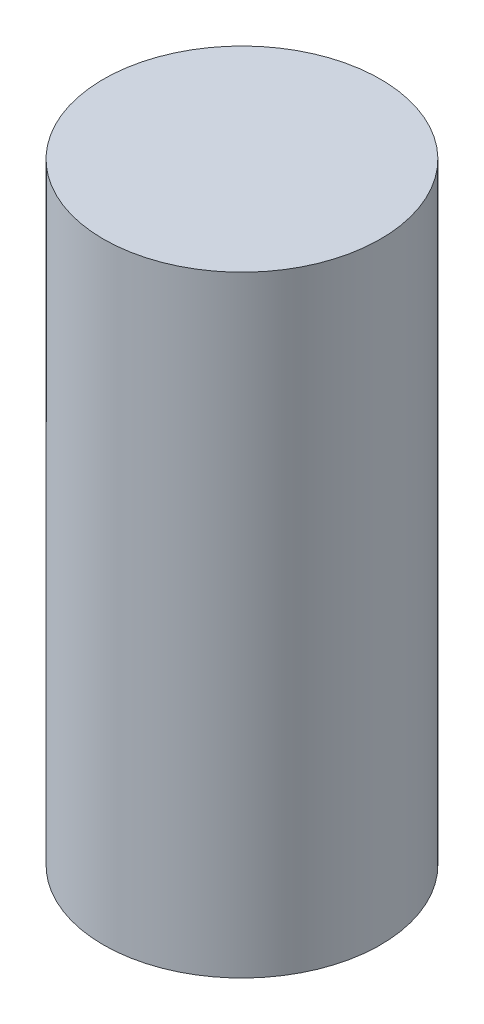
ISO-10303-21;
HEADER;
FILE_DESCRIPTION(('STEP AP214'),'2;1');
FILE_NAME('part.step','',(''),(''),'','','');
FILE_SCHEMA(('AUTOMOTIVE_DESIGN { 1 0 10303 214 1 1 1 1 }'));
ENDSEC;
DATA;
#1=APPLICATION_CONTEXT('core data for automotive mechanical design processes');
#2=APPLICATION_PROTOCOL_DEFINITION('international standard','automotive_design',2000,#1);
#3=PRODUCT_CONTEXT('',#1,'mechanical');
#4=PRODUCT('Part','Part','',(#3));
#5=PRODUCT_RELATED_PRODUCT_CATEGORY('part','',(#4));
#6=PRODUCT_DEFINITION_FORMATION('','',#4);
#7=PRODUCT_DEFINITION_CONTEXT('part definition',#1,'design');
#8=PRODUCT_DEFINITION('design','',#6,#7);
#9=PRODUCT_DEFINITION_SHAPE('','',#8);
#10=(LENGTH_UNIT() NAMED_UNIT(*) SI_UNIT(.MILLI.,.METRE.));
#11=(NAMED_UNIT(*) PLANE_ANGLE_UNIT() SI_UNIT($,.RADIAN.));
#12=(NAMED_UNIT(*) SI_UNIT($,.STERADIAN.) SOLID_ANGLE_UNIT());
#13=UNCERTAINTY_MEASURE_WITH_UNIT(LENGTH_MEASURE(1.E-05),#10,'distance_accuracy_value','');
#14=(GEOMETRIC_REPRESENTATION_CONTEXT(3) GLOBAL_UNCERTAINTY_ASSIGNED_CONTEXT((#13)) GLOBAL_UNIT_ASSIGNED_CONTEXT((#10,
#11,#12)) REPRESENTATION_CONTEXT('',''));
#15=CARTESIAN_POINT('',(0.,0.,0.));
#16=DIRECTION('',(0.,0.,1.));
#17=DIRECTION('',(1.,0.,0.));
#18=AXIS2_PLACEMENT_3D('',#15,#16,#17);
#19=CARTESIAN_POINT('',(0.,-300.,0.));
#20=DIRECTION('',(0.,1.,0.));
#21=DIRECTION('',(0.,0.,1.));
#22=AXIS2_PLACEMENT_3D('',#19,#20,#21);
#23=CYLINDRICAL_SURFACE('',#22,68.);
#24=CARTESIAN_POINT('',(0.,-300.,0.));
#25=DIRECTION('',(0.,1.,0.));
#26=DIRECTION('',(0.,0.,1.));
#27=AXIS2_PLACEMENT_3D('',#24,#25,#26);
#28=CIRCLE('',#27,68.);
#29=CARTESIAN_POINT('',(0.,-300.,68.));
#30=VERTEX_POINT('',#29);
#31=EDGE_CURVE('E10',#30,#30,#28,.T.);
#32=ORIENTED_EDGE('',*,*,#31,.T.);
#33=EDGE_LOOP('',(#32));
#34=FACE_BOUND('',#33,.T.);
#35=CARTESIAN_POINT('',(0.,0.,0.));
#36=DIRECTION('',(0.,1.,0.));
#37=DIRECTION('',(0.,0.,1.));
#38=AXIS2_PLACEMENT_3D('',#35,#36,#37);
#39=CIRCLE('',#38,68.);
#40=CARTESIAN_POINT('',(0.,0.,68.));
#41=VERTEX_POINT('',#40);
#42=EDGE_CURVE('E39',#41,#41,#39,.T.);
#43=ORIENTED_EDGE('',*,*,#42,.F.);
#44=EDGE_LOOP('',(#43));
#45=FACE_BOUND('',#44,.T.);
#46=ADVANCED_FACE('F36',(#34,#45),#23,.T.);
#47=CARTESIAN_POINT('',(0.,-300.,0.));
#48=DIRECTION('',(0.,1.,0.));
#49=DIRECTION('',(0.,0.,1.));
#50=AXIS2_PLACEMENT_3D('',#47,#48,#49);
#51=PLANE('',#50);
#52=CARTESIAN_POINT('',(0.,-300.,0.));
#53=DIRECTION('',(0.,1.,0.));
#54=DIRECTION('',(0.,0.,1.));
#55=AXIS2_PLACEMENT_3D('',#52,#53,#54);
#56=CIRCLE('',#55,63.);
#57=CARTESIAN_POINT('',(0.,-300.,63.));
#58=VERTEX_POINT('',#57);
#59=EDGE_CURVE('E46',#58,#58,#56,.T.);
#60=ORIENTED_EDGE('',*,*,#59,.T.);
#61=EDGE_LOOP('',(#60));
#62=FACE_BOUND('',#61,.T.);
#63=ORIENTED_EDGE('',*,*,#31,.F.);
#64=EDGE_LOOP('',(#63));
#65=FACE_BOUND('',#64,.T.);
#66=ADVANCED_FACE('F67',(#62,#65),#51,.F.);
#67=CARTESIAN_POINT('',(0.,0.,0.));
#68=DIRECTION('',(0.,1.,0.));
#69=DIRECTION('',(0.,0.,1.));
#70=AXIS2_PLACEMENT_3D('',#67,#68,#69);
#71=PLANE('',#70);
#72=ORIENTED_EDGE('',*,*,#42,.T.);
#73=EDGE_LOOP('',(#72));
#74=FACE_BOUND('',#73,.T.);
#75=ADVANCED_FACE('F62',(#74),#71,.T.);
#76=CARTESIAN_POINT('',(0.,-300.,0.));
#77=DIRECTION('',(0.,1.,0.));
#78=DIRECTION('',(0.,0.,1.));
#79=AXIS2_PLACEMENT_3D('',#76,#77,#78);
#80=CYLINDRICAL_SURFACE('',#79,63.);
#81=ORIENTED_EDGE('',*,*,#59,.F.);
#82=EDGE_LOOP('',(#81));
#83=FACE_BOUND('',#82,.T.);
#84=CARTESIAN_POINT('',(0.,-5.,0.));
#85=DIRECTION('',(0.,1.,0.));
#86=DIRECTION('',(0.,0.,1.));
#87=AXIS2_PLACEMENT_3D('',#84,#85,#86);
#88=CIRCLE('',#87,63.);
#89=CARTESIAN_POINT('',(0.,-5.,63.));
#90=VERTEX_POINT('',#89);
#91=EDGE_CURVE('E50',#90,#90,#88,.T.);
#92=ORIENTED_EDGE('',*,*,#91,.T.);
#93=EDGE_LOOP('',(#92));
#94=FACE_BOUND('',#93,.T.);
#95=ADVANCED_FACE('F54',(#83,#94),#80,.F.);
#96=CARTESIAN_POINT('',(0.,-5.,0.));
#97=DIRECTION('',(0.,1.,0.));
#98=DIRECTION('',(0.,0.,1.));
#99=AXIS2_PLACEMENT_3D('',#96,#97,#98);
#100=PLANE('',#99);
#101=ORIENTED_EDGE('',*,*,#91,.F.);
#102=EDGE_LOOP('',(#101));
#103=FACE_BOUND('',#102,.T.);
#104=ADVANCED_FACE('F56',(#103),#100,.F.);
#105=CLOSED_SHELL('',(#46,#66,#75,#95,#104));
#106=MANIFOLD_SOLID_BREP('B2',#105);
#107=ADVANCED_BREP_SHAPE_REPRESENTATION('',(#18,#106),#14);
#108=SHAPE_DEFINITION_REPRESENTATION(#9,#107);
ENDSEC;
END-ISO-10303-21;
